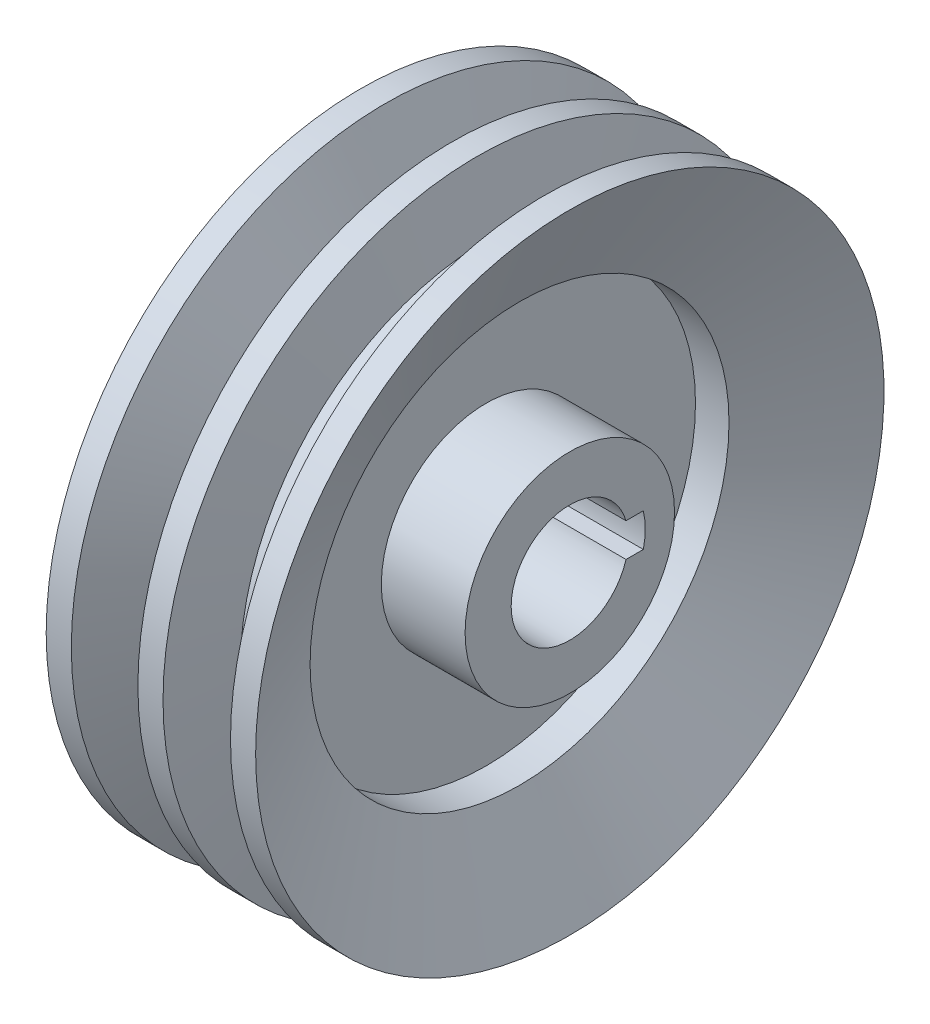
ISO-10303-21;
HEADER;
FILE_DESCRIPTION(('STEP AP214'),'2;1');
FILE_NAME('part.step','',(''),(''),'','','');
FILE_SCHEMA(('AUTOMOTIVE_DESIGN { 1 0 10303 214 1 1 1 1 }'));
ENDSEC;
DATA;
#1=APPLICATION_CONTEXT('core data for automotive mechanical design processes');
#2=APPLICATION_PROTOCOL_DEFINITION('international standard','automotive_design',2000,#1);
#3=PRODUCT_CONTEXT('',#1,'mechanical');
#4=PRODUCT('Part','Part','',(#3));
#5=PRODUCT_RELATED_PRODUCT_CATEGORY('part','',(#4));
#6=PRODUCT_DEFINITION_FORMATION('','',#4);
#7=PRODUCT_DEFINITION_CONTEXT('part definition',#1,'design');
#8=PRODUCT_DEFINITION('design','',#6,#7);
#9=PRODUCT_DEFINITION_SHAPE('','',#8);
#10=(LENGTH_UNIT() NAMED_UNIT(*) SI_UNIT(.MILLI.,.METRE.));
#11=(NAMED_UNIT(*) PLANE_ANGLE_UNIT() SI_UNIT($,.RADIAN.));
#12=(NAMED_UNIT(*) SI_UNIT($,.STERADIAN.) SOLID_ANGLE_UNIT());
#13=UNCERTAINTY_MEASURE_WITH_UNIT(LENGTH_MEASURE(1.E-05),#10,'distance_accuracy_value','');
#14=(GEOMETRIC_REPRESENTATION_CONTEXT(3) GLOBAL_UNCERTAINTY_ASSIGNED_CONTEXT((#13)) GLOBAL_UNIT_ASSIGNED_CONTEXT((#10,
#11,#12)) REPRESENTATION_CONTEXT('',''));
#15=CARTESIAN_POINT('',(0.,0.,0.));
#16=DIRECTION('',(0.,0.,1.));
#17=DIRECTION('',(1.,0.,0.));
#18=AXIS2_PLACEMENT_3D('',#15,#16,#17);
#19=CARTESIAN_POINT('',(-757.808630679209,-495.3,0.));
#20=DIRECTION('',(-1.,0.,0.));
#21=DIRECTION('',(0.,0.,1.));
#22=AXIS2_PLACEMENT_3D('',#19,#20,#21);
#23=CYLINDRICAL_SURFACE('',#22,635.);
#24=CARTESIAN_POINT('',(127.,-495.3,0.));
#25=DIRECTION('',(-1.,0.,0.));
#26=DIRECTION('',(0.,0.,1.));
#27=AXIS2_PLACEMENT_3D('',#24,#25,#26);
#28=CIRCLE('',#27,635.);
#29=CARTESIAN_POINT('',(127.,-495.3,635.));
#30=VERTEX_POINT('',#29);
#31=EDGE_CURVE('E11',#30,#30,#28,.T.);
#32=ORIENTED_EDGE('',*,*,#31,.F.);
#33=EDGE_LOOP('',(#32));
#34=FACE_BOUND('',#33,.T.);
#35=CARTESIAN_POINT('',(635.,-495.3,0.));
#36=DIRECTION('',(-1.,0.,0.));
#37=DIRECTION('',(0.,0.,1.));
#38=AXIS2_PLACEMENT_3D('',#35,#36,#37);
#39=CIRCLE('',#38,635.);
#40=CARTESIAN_POINT('',(635.,-495.3,635.));
#41=VERTEX_POINT('',#40);
#42=EDGE_CURVE('E92',#41,#41,#39,.T.);
#43=ORIENTED_EDGE('',*,*,#42,.T.);
#44=EDGE_LOOP('',(#43));
#45=FACE_BOUND('',#44,.T.);
#46=ADVANCED_FACE('F37',(#34,#45),#23,.T.);
#47=CARTESIAN_POINT('',(127.,774.7,0.));
#48=DIRECTION('',(-1.,0.,0.));
#49=DIRECTION('',(0.,0.,1.));
#50=AXIS2_PLACEMENT_3D('',#47,#48,#49);
#51=PLANE('',#50);
#52=CARTESIAN_POINT('',(127.,-495.3,0.));
#53=DIRECTION('',(-1.,0.,0.));
#54=DIRECTION('',(0.,0.,1.));
#55=AXIS2_PLACEMENT_3D('',#52,#53,#54);
#56=CIRCLE('',#55,1270.);
#57=CARTESIAN_POINT('',(127.,-495.3,1270.));
#58=VERTEX_POINT('',#57);
#59=EDGE_CURVE('E44',#58,#58,#56,.T.);
#60=ORIENTED_EDGE('',*,*,#59,.F.);
#61=EDGE_LOOP('',(#60));
#62=FACE_BOUND('',#61,.T.);
#63=ORIENTED_EDGE('',*,*,#31,.T.);
#64=EDGE_LOOP('',(#63));
#65=FACE_BOUND('',#64,.T.);
#66=ADVANCED_FACE('F164',(#62,#65),#51,.F.);
#67=CARTESIAN_POINT('',(-757.808630679209,-495.3,0.));
#68=DIRECTION('',(-1.,0.,0.));
#69=DIRECTION('',(0.,0.,1.));
#70=AXIS2_PLACEMENT_3D('',#67,#68,#69);
#71=CYLINDRICAL_SURFACE('',#70,1270.);
#72=CARTESIAN_POINT('',(330.2,-495.3,0.));
#73=DIRECTION('',(-1.,0.,0.));
#74=DIRECTION('',(0.,0.,1.));
#75=AXIS2_PLACEMENT_3D('',#72,#73,#74);
#76=CIRCLE('',#75,1270.);
#77=CARTESIAN_POINT('',(330.2,-495.3,1270.));
#78=VERTEX_POINT('',#77);
#79=EDGE_CURVE('E157',#78,#78,#76,.T.);
#80=ORIENTED_EDGE('',*,*,#79,.F.);
#81=EDGE_LOOP('',(#80));
#82=FACE_BOUND('',#81,.T.);
#83=ORIENTED_EDGE('',*,*,#59,.T.);
#84=EDGE_LOOP('',(#83));
#85=FACE_BOUND('',#84,.T.);
#86=ADVANCED_FACE('F162',(#82,#85),#71,.F.);
#87=CARTESIAN_POINT('',(330.2,-495.3,0.));
#88=DIRECTION('',(1.,0.,0.));
#89=DIRECTION('',(0.,0.,-1.));
#90=AXIS2_PLACEMENT_3D('',#87,#88,#89);
#91=CONICAL_SURFACE('',#90,1270.,1.12327635163773);
#92=CARTESIAN_POINT('',(635.,-495.3,0.));
#93=DIRECTION('',(-1.,0.,0.));
#94=DIRECTION('',(0.,0.,1.));
#95=AXIS2_PLACEMENT_3D('',#92,#93,#94);
#96=CIRCLE('',#95,1905.);
#97=CARTESIAN_POINT('',(635.,-495.3,1905.));
#98=VERTEX_POINT('',#97);
#99=EDGE_CURVE('E154',#98,#98,#96,.T.);
#100=ORIENTED_EDGE('',*,*,#99,.F.);
#101=EDGE_LOOP('',(#100));
#102=FACE_BOUND('',#101,.T.);
#103=ORIENTED_EDGE('',*,*,#79,.T.);
#104=EDGE_LOOP('',(#103));
#105=FACE_BOUND('',#104,.T.);
#106=ADVANCED_FACE('F247',(#102,#105),#91,.F.);
#107=CARTESIAN_POINT('',(-757.808630679209,-495.3,0.));
#108=DIRECTION('',(-1.,0.,0.));
#109=DIRECTION('',(0.,0.,1.));
#110=AXIS2_PLACEMENT_3D('',#107,#108,#109);
#111=CYLINDRICAL_SURFACE('',#110,1905.);
#112=CARTESIAN_POINT('',(482.6,-495.3,0.));
#113=DIRECTION('',(-1.,0.,0.));
#114=DIRECTION('',(0.,0.,1.));
#115=AXIS2_PLACEMENT_3D('',#112,#113,#114);
#116=CIRCLE('',#115,1905.);
#117=CARTESIAN_POINT('',(482.6,-495.3,1905.));
#118=VERTEX_POINT('',#117);
#119=EDGE_CURVE('E151',#118,#118,#116,.T.);
#120=ORIENTED_EDGE('',*,*,#119,.F.);
#121=EDGE_LOOP('',(#120));
#122=FACE_BOUND('',#121,.T.);
#123=ORIENTED_EDGE('',*,*,#99,.T.);
#124=EDGE_LOOP('',(#123));
#125=FACE_BOUND('',#124,.T.);
#126=ADVANCED_FACE('F243',(#122,#125),#111,.T.);
#127=CARTESIAN_POINT('',(482.6,-495.3,0.));
#128=DIRECTION('',(1.,0.,0.));
#129=DIRECTION('',(0.,0.,-1.));
#130=AXIS2_PLACEMENT_3D('',#127,#128,#129);
#131=CONICAL_SURFACE('',#130,1905.,1.12327635163773);
#132=CARTESIAN_POINT('',(287.528,-495.3,0.));
#133=DIRECTION('',(-1.,0.,0.));
#134=DIRECTION('',(0.,0.,1.));
#135=AXIS2_PLACEMENT_3D('',#132,#133,#134);
#136=CIRCLE('',#135,1498.6);
#137=CARTESIAN_POINT('',(287.528,-495.3,1498.6));
#138=VERTEX_POINT('',#137);
#139=EDGE_CURVE('E148',#138,#138,#136,.T.);
#140=ORIENTED_EDGE('',*,*,#139,.F.);
#141=EDGE_LOOP('',(#140));
#142=FACE_BOUND('',#141,.T.);
#143=ORIENTED_EDGE('',*,*,#119,.T.);
#144=EDGE_LOOP('',(#143));
#145=FACE_BOUND('',#144,.T.);
#146=ADVANCED_FACE('F239',(#142,#145),#131,.T.);
#147=CARTESIAN_POINT('',(-757.808630679209,-495.3,0.));
#148=DIRECTION('',(-1.,0.,0.));
#149=DIRECTION('',(0.,0.,1.));
#150=AXIS2_PLACEMENT_3D('',#147,#148,#149);
#151=CYLINDRICAL_SURFACE('',#150,1498.6);
#152=CARTESIAN_POINT('',(135.128,-495.3,0.));
#153=DIRECTION('',(-1.,0.,0.));
#154=DIRECTION('',(0.,0.,1.));
#155=AXIS2_PLACEMENT_3D('',#152,#153,#154);
#156=CIRCLE('',#155,1498.6);
#157=CARTESIAN_POINT('',(135.128,-495.3,1498.6));
#158=VERTEX_POINT('',#157);
#159=EDGE_CURVE('E145',#158,#158,#156,.T.);
#160=ORIENTED_EDGE('',*,*,#159,.F.);
#161=EDGE_LOOP('',(#160));
#162=FACE_BOUND('',#161,.T.);
#163=ORIENTED_EDGE('',*,*,#139,.T.);
#164=EDGE_LOOP('',(#163));
#165=FACE_BOUND('',#164,.T.);
#166=ADVANCED_FACE('F235',(#162,#165),#151,.T.);
#167=CARTESIAN_POINT('',(135.128,-495.3,0.));
#168=DIRECTION('',(-1.,0.,0.));
#169=DIRECTION('',(0.,0.,1.));
#170=AXIS2_PLACEMENT_3D('',#167,#168,#169);
#171=CONICAL_SURFACE('',#170,1498.6,1.42035083214526);
#172=CARTESIAN_POINT('',(73.521450378508,-495.3,0.));
#173=DIRECTION('',(-1.,0.,0.));
#174=DIRECTION('',(0.,0.,1.));
#175=AXIS2_PLACEMENT_3D('',#172,#173,#174);
#176=CIRCLE('',#175,1905.);
#177=CARTESIAN_POINT('',(73.521450378508,-495.3,1905.));
#178=VERTEX_POINT('',#177);
#179=EDGE_CURVE('E142',#178,#178,#176,.T.);
#180=ORIENTED_EDGE('',*,*,#179,.F.);
#181=EDGE_LOOP('',(#180));
#182=FACE_BOUND('',#181,.T.);
#183=ORIENTED_EDGE('',*,*,#159,.T.);
#184=EDGE_LOOP('',(#183));
#185=FACE_BOUND('',#184,.T.);
#186=ADVANCED_FACE('F231',(#182,#185),#171,.T.);
#187=CARTESIAN_POINT('',(-757.808630679209,-495.3,0.));
#188=DIRECTION('',(-1.,0.,0.));
#189=DIRECTION('',(0.,0.,1.));
#190=AXIS2_PLACEMENT_3D('',#187,#188,#189);
#191=CYLINDRICAL_SURFACE('',#190,1905.);
#192=CARTESIAN_POINT('',(-78.878549621492,-495.3,0.));
#193=DIRECTION('',(-1.,0.,0.));
#194=DIRECTION('',(0.,0.,1.));
#195=AXIS2_PLACEMENT_3D('',#192,#193,#194);
#196=CIRCLE('',#195,1905.);
#197=CARTESIAN_POINT('',(-78.878549621492,-495.3,1905.));
#198=VERTEX_POINT('',#197);
#199=EDGE_CURVE('E139',#198,#198,#196,.T.);
#200=ORIENTED_EDGE('',*,*,#199,.F.);
#201=EDGE_LOOP('',(#200));
#202=FACE_BOUND('',#201,.T.);
#203=ORIENTED_EDGE('',*,*,#179,.T.);
#204=EDGE_LOOP('',(#203));
#205=FACE_BOUND('',#204,.T.);
#206=ADVANCED_FACE('F227',(#202,#205),#191,.T.);
#207=CARTESIAN_POINT('',(-78.878549621492,-495.3,0.));
#208=DIRECTION('',(1.,0.,0.));
#209=DIRECTION('',(0.,0.,-1.));
#210=AXIS2_PLACEMENT_3D('',#207,#208,#209);
#211=CONICAL_SURFACE('',#210,1905.,1.43326106171532);
#212=CARTESIAN_POINT('',(-135.128,-495.3,0.));
#213=DIRECTION('',(-1.,0.,0.));
#214=DIRECTION('',(0.,0.,1.));
#215=AXIS2_PLACEMENT_3D('',#212,#213,#214);
#216=CIRCLE('',#215,1498.6);
#217=CARTESIAN_POINT('',(-135.128,-495.3,1498.6));
#218=VERTEX_POINT('',#217);
#219=EDGE_CURVE('E136',#218,#218,#216,.T.);
#220=ORIENTED_EDGE('',*,*,#219,.F.);
#221=EDGE_LOOP('',(#220));
#222=FACE_BOUND('',#221,.T.);
#223=ORIENTED_EDGE('',*,*,#199,.T.);
#224=EDGE_LOOP('',(#223));
#225=FACE_BOUND('',#224,.T.);
#226=ADVANCED_FACE('F223',(#222,#225),#211,.T.);
#227=CARTESIAN_POINT('',(-757.808630679209,-495.3,0.));
#228=DIRECTION('',(-1.,0.,0.));
#229=DIRECTION('',(0.,0.,1.));
#230=AXIS2_PLACEMENT_3D('',#227,#228,#229);
#231=CYLINDRICAL_SURFACE('',#230,1498.6);
#232=CARTESIAN_POINT('',(-287.528,-495.3,0.));
#233=DIRECTION('',(-1.,0.,0.));
#234=DIRECTION('',(0.,0.,1.));
#235=AXIS2_PLACEMENT_3D('',#232,#233,#234);
#236=CIRCLE('',#235,1498.6);
#237=CARTESIAN_POINT('',(-287.528,-495.3,1498.6));
#238=VERTEX_POINT('',#237);
#239=EDGE_CURVE('E133',#238,#238,#236,.T.);
#240=ORIENTED_EDGE('',*,*,#239,.F.);
#241=EDGE_LOOP('',(#240));
#242=FACE_BOUND('',#241,.T.);
#243=ORIENTED_EDGE('',*,*,#219,.T.);
#244=EDGE_LOOP('',(#243));
#245=FACE_BOUND('',#244,.T.);
#246=ADVANCED_FACE('F219',(#242,#245),#231,.T.);
#247=CARTESIAN_POINT('',(-287.528,-495.3,0.));
#248=DIRECTION('',(-1.,0.,0.));
#249=DIRECTION('',(0.,0.,1.));
#250=AXIS2_PLACEMENT_3D('',#247,#248,#249);
#251=CONICAL_SURFACE('',#250,1498.6,1.12327635163773);
#252=CARTESIAN_POINT('',(-482.6,-495.3,0.));
#253=DIRECTION('',(-1.,0.,0.));
#254=DIRECTION('',(0.,0.,1.));
#255=AXIS2_PLACEMENT_3D('',#252,#253,#254);
#256=CIRCLE('',#255,1905.);
#257=CARTESIAN_POINT('',(-482.6,-495.3,1905.));
#258=VERTEX_POINT('',#257);
#259=EDGE_CURVE('E130',#258,#258,#256,.T.);
#260=ORIENTED_EDGE('',*,*,#259,.F.);
#261=EDGE_LOOP('',(#260));
#262=FACE_BOUND('',#261,.T.);
#263=ORIENTED_EDGE('',*,*,#239,.T.);
#264=EDGE_LOOP('',(#263));
#265=FACE_BOUND('',#264,.T.);
#266=ADVANCED_FACE('F215',(#262,#265),#251,.T.);
#267=CARTESIAN_POINT('',(-757.808630679209,-495.3,0.));
#268=DIRECTION('',(-1.,0.,0.));
#269=DIRECTION('',(0.,0.,1.));
#270=AXIS2_PLACEMENT_3D('',#267,#268,#269);
#271=CYLINDRICAL_SURFACE('',#270,1905.);
#272=CARTESIAN_POINT('',(-635.,-495.3,0.));
#273=DIRECTION('',(-1.,0.,0.));
#274=DIRECTION('',(0.,0.,1.));
#275=AXIS2_PLACEMENT_3D('',#272,#273,#274);
#276=CIRCLE('',#275,1905.);
#277=CARTESIAN_POINT('',(-635.,-495.3,1905.));
#278=VERTEX_POINT('',#277);
#279=EDGE_CURVE('E127',#278,#278,#276,.T.);
#280=ORIENTED_EDGE('',*,*,#279,.F.);
#281=EDGE_LOOP('',(#280));
#282=FACE_BOUND('',#281,.T.);
#283=ORIENTED_EDGE('',*,*,#259,.T.);
#284=EDGE_LOOP('',(#283));
#285=FACE_BOUND('',#284,.T.);
#286=ADVANCED_FACE('F211',(#282,#285),#271,.T.);
#287=CARTESIAN_POINT('',(-635.,-495.3,0.));
#288=DIRECTION('',(-1.,0.,0.));
#289=DIRECTION('',(0.,0.,1.));
#290=AXIS2_PLACEMENT_3D('',#287,#288,#289);
#291=CONICAL_SURFACE('',#290,1905.,1.12327635163773);
#292=CARTESIAN_POINT('',(-330.2,-495.3,0.));
#293=DIRECTION('',(-1.,0.,0.));
#294=DIRECTION('',(0.,0.,1.));
#295=AXIS2_PLACEMENT_3D('',#292,#293,#294);
#296=CIRCLE('',#295,1270.);
#297=CARTESIAN_POINT('',(-330.2,-495.3,1270.));
#298=VERTEX_POINT('',#297);
#299=EDGE_CURVE('E124',#298,#298,#296,.T.);
#300=ORIENTED_EDGE('',*,*,#299,.F.);
#301=EDGE_LOOP('',(#300));
#302=FACE_BOUND('',#301,.T.);
#303=ORIENTED_EDGE('',*,*,#279,.T.);
#304=EDGE_LOOP('',(#303));
#305=FACE_BOUND('',#304,.T.);
#306=ADVANCED_FACE('F207',(#302,#305),#291,.F.);
#307=CARTESIAN_POINT('',(-757.808630679209,-495.3,0.));
#308=DIRECTION('',(-1.,0.,0.));
#309=DIRECTION('',(0.,0.,1.));
#310=AXIS2_PLACEMENT_3D('',#307,#308,#309);
#311=CYLINDRICAL_SURFACE('',#310,1270.);
#312=CARTESIAN_POINT('',(-127.,-495.3,0.));
#313=DIRECTION('',(-1.,0.,0.));
#314=DIRECTION('',(0.,0.,1.));
#315=AXIS2_PLACEMENT_3D('',#312,#313,#314);
#316=CIRCLE('',#315,1270.);
#317=CARTESIAN_POINT('',(-127.,-495.3,1270.));
#318=VERTEX_POINT('',#317);
#319=EDGE_CURVE('E121',#318,#318,#316,.T.);
#320=ORIENTED_EDGE('',*,*,#319,.F.);
#321=EDGE_LOOP('',(#320));
#322=FACE_BOUND('',#321,.T.);
#323=ORIENTED_EDGE('',*,*,#299,.T.);
#324=EDGE_LOOP('',(#323));
#325=FACE_BOUND('',#324,.T.);
#326=ADVANCED_FACE('F203',(#322,#325),#311,.F.);
#327=CARTESIAN_POINT('',(-127.,139.7,0.));
#328=DIRECTION('',(1.,0.,0.));
#329=DIRECTION('',(0.,0.,-1.));
#330=AXIS2_PLACEMENT_3D('',#327,#328,#329);
#331=PLANE('',#330);
#332=CARTESIAN_POINT('',(-127.,-495.3,0.));
#333=DIRECTION('',(-1.,0.,0.));
#334=DIRECTION('',(0.,0.,1.));
#335=AXIS2_PLACEMENT_3D('',#332,#333,#334);
#336=CIRCLE('',#335,635.);
#337=CARTESIAN_POINT('',(-127.,-495.3,635.));
#338=VERTEX_POINT('',#337);
#339=EDGE_CURVE('E118',#338,#338,#336,.T.);
#340=ORIENTED_EDGE('',*,*,#339,.F.);
#341=EDGE_LOOP('',(#340));
#342=FACE_BOUND('',#341,.T.);
#343=ORIENTED_EDGE('',*,*,#319,.T.);
#344=EDGE_LOOP('',(#343));
#345=FACE_BOUND('',#344,.T.);
#346=ADVANCED_FACE('F199',(#342,#345),#331,.F.);
#347=CARTESIAN_POINT('',(-757.808630679209,-495.3,0.));
#348=DIRECTION('',(-1.,0.,0.));
#349=DIRECTION('',(0.,0.,1.));
#350=AXIS2_PLACEMENT_3D('',#347,#348,#349);
#351=CYLINDRICAL_SURFACE('',#350,635.);
#352=CARTESIAN_POINT('',(-635.,-495.3,0.));
#353=DIRECTION('',(-1.,0.,0.));
#354=DIRECTION('',(0.,0.,1.));
#355=AXIS2_PLACEMENT_3D('',#352,#353,#354);
#356=CIRCLE('',#355,635.);
#357=CARTESIAN_POINT('',(-635.,-495.3,635.));
#358=VERTEX_POINT('',#357);
#359=EDGE_CURVE('E115',#358,#358,#356,.T.);
#360=ORIENTED_EDGE('',*,*,#359,.F.);
#361=EDGE_LOOP('',(#360));
#362=FACE_BOUND('',#361,.T.);
#363=ORIENTED_EDGE('',*,*,#339,.T.);
#364=EDGE_LOOP('',(#363));
#365=FACE_BOUND('',#364,.T.);
#366=ADVANCED_FACE('F196',(#362,#365),#351,.T.);
#367=CARTESIAN_POINT('',(-635.,-139.7,0.));
#368=DIRECTION('',(1.,0.,0.));
#369=DIRECTION('',(0.,0.,-1.));
#370=AXIS2_PLACEMENT_3D('',#367,#368,#369);
#371=PLANE('',#370);
#372=CARTESIAN_POINT('',(-635.,-495.3,0.));
#373=DIRECTION('',(-1.,0.,0.));
#374=DIRECTION('',(0.,0.,1.));
#375=AXIS2_PLACEMENT_3D('',#372,#373,#374);
#376=CIRCLE('',#375,355.6);
#377=CARTESIAN_POINT('',(-635.,-596.9,-340.776759770968));
#378=VERTEX_POINT('',#377);
#379=CARTESIAN_POINT('',(-635.,-393.7,-340.776759770968));
#380=VERTEX_POINT('',#379);
#381=EDGE_CURVE('E113',#378,#380,#376,.T.);
#382=ORIENTED_EDGE('',*,*,#381,.F.);
#383=DIRECTION('',(0.,0.,1.));
#384=VECTOR('',#383,1.);
#385=CARTESIAN_POINT('',(-635.,-596.9,-340.776759770968));
#386=LINE('',#385,#384);
#387=CARTESIAN_POINT('',(-635.,-596.9,-445.76819087952));
#388=VERTEX_POINT('',#387);
#389=EDGE_CURVE('E96',#388,#378,#386,.T.);
#390=ORIENTED_EDGE('',*,*,#389,.F.);
#391=CARTESIAN_POINT('',(-635.,-495.3,1.11022302462516E-13));
#392=DIRECTION('',(1.,0.,0.));
#393=DIRECTION('',(0.,0.,-1.));
#394=AXIS2_PLACEMENT_3D('',#391,#392,#393);
#395=CIRCLE('',#394,457.2);
#396=CARTESIAN_POINT('',(-635.,-393.7,-445.76819087952));
#397=VERTEX_POINT('',#396);
#398=EDGE_CURVE('E78',#397,#388,#395,.F.);
#399=ORIENTED_EDGE('',*,*,#398,.F.);
#400=DIRECTION('',(0.,0.,-1.));
#401=VECTOR('',#400,1.);
#402=CARTESIAN_POINT('',(-635.,-393.7,-340.776759770968));
#403=LINE('',#402,#401);
#404=EDGE_CURVE('E86',#380,#397,#403,.T.);
#405=ORIENTED_EDGE('',*,*,#404,.F.);
#406=EDGE_LOOP('',(#382,#390,#399,#405));
#407=FACE_BOUND('',#406,.T.);
#408=ORIENTED_EDGE('',*,*,#359,.T.);
#409=EDGE_LOOP('',(#408));
#410=FACE_BOUND('',#409,.T.);
#411=ADVANCED_FACE('F94',(#407,#410),#371,.F.);
#412=CARTESIAN_POINT('',(-757.808630679209,-495.3,0.));
#413=DIRECTION('',(-1.,0.,0.));
#414=DIRECTION('',(0.,0.,1.));
#415=AXIS2_PLACEMENT_3D('',#412,#413,#414);
#416=CYLINDRICAL_SURFACE('',#415,355.6);
#417=CARTESIAN_POINT('',(635.,-495.3,0.));
#418=DIRECTION('',(-1.,0.,0.));
#419=DIRECTION('',(0.,0.,1.));
#420=AXIS2_PLACEMENT_3D('',#417,#418,#419);
#421=CIRCLE('',#420,355.6);
#422=CARTESIAN_POINT('',(635.,-596.9,-340.776759770968));
#423=VERTEX_POINT('',#422);
#424=CARTESIAN_POINT('',(635.,-393.7,-340.776759770968));
#425=VERTEX_POINT('',#424);
#426=EDGE_CURVE('E110',#423,#425,#421,.T.);
#427=ORIENTED_EDGE('',*,*,#426,.F.);
#428=DIRECTION('',(1.,0.,0.));
#429=VECTOR('',#428,1.);
#430=CARTESIAN_POINT('',(-635.001,-596.9,-340.776759770968));
#431=LINE('',#430,#429);
#432=EDGE_CURVE('E105',#378,#423,#431,.T.);
#433=ORIENTED_EDGE('',*,*,#432,.F.);
#434=ORIENTED_EDGE('',*,*,#381,.T.);
#435=DIRECTION('',(1.,0.,0.));
#436=VECTOR('',#435,1.);
#437=CARTESIAN_POINT('',(-635.001,-393.7,-340.776759770968));
#438=LINE('',#437,#436);
#439=EDGE_CURVE('E82',#380,#425,#438,.T.);
#440=ORIENTED_EDGE('',*,*,#439,.T.);
#441=EDGE_LOOP('',(#427,#433,#434,#440));
#442=FACE_BOUND('',#441,.T.);
#443=ADVANCED_FACE('F176',(#442),#416,.F.);
#444=CARTESIAN_POINT('',(635.,-139.7,0.));
#445=DIRECTION('',(-1.,0.,0.));
#446=DIRECTION('',(0.,0.,1.));
#447=AXIS2_PLACEMENT_3D('',#444,#445,#446);
#448=PLANE('',#447);
#449=ORIENTED_EDGE('',*,*,#42,.F.);
#450=EDGE_LOOP('',(#449));
#451=FACE_BOUND('',#450,.T.);
#452=CARTESIAN_POINT('',(635.,-495.3,1.11022302462516E-13));
#453=DIRECTION('',(1.,0.,0.));
#454=DIRECTION('',(0.,0.,1.));
#455=AXIS2_PLACEMENT_3D('',#452,#453,#454);
#456=CIRCLE('',#455,457.2);
#457=CARTESIAN_POINT('',(635.,-596.9,-445.76819087952));
#458=VERTEX_POINT('',#457);
#459=CARTESIAN_POINT('',(635.,-393.7,-445.76819087952));
#460=VERTEX_POINT('',#459);
#461=EDGE_CURVE('E51',#458,#460,#456,.T.);
#462=ORIENTED_EDGE('',*,*,#461,.F.);
#463=DIRECTION('',(0.,0.,-1.));
#464=VECTOR('',#463,1.);
#465=CARTESIAN_POINT('',(635.,-596.9,-340.776759770968));
#466=LINE('',#465,#464);
#467=EDGE_CURVE('E83',#423,#458,#466,.T.);
#468=ORIENTED_EDGE('',*,*,#467,.F.);
#469=ORIENTED_EDGE('',*,*,#426,.T.);
#470=DIRECTION('',(0.,0.,1.));
#471=VECTOR('',#470,1.);
#472=CARTESIAN_POINT('',(635.,-393.7,-340.776759770968));
#473=LINE('',#472,#471);
#474=EDGE_CURVE('E101',#460,#425,#473,.T.);
#475=ORIENTED_EDGE('',*,*,#474,.F.);
#476=EDGE_LOOP('',(#462,#468,#469,#475));
#477=FACE_BOUND('',#476,.T.);
#478=ADVANCED_FACE('F173',(#451,#477),#448,.F.);
#479=CARTESIAN_POINT('',(-635.001,-495.3,1.11022302462516E-13));
#480=DIRECTION('',(1.,0.,0.));
#481=DIRECTION('',(0.,0.,-1.));
#482=AXIS2_PLACEMENT_3D('',#479,#480,#481);
#483=CYLINDRICAL_SURFACE('',#482,457.2);
#484=ORIENTED_EDGE('',*,*,#398,.T.);
#485=DIRECTION('',(1.,0.,0.));
#486=VECTOR('',#485,1.);
#487=CARTESIAN_POINT('',(-635.001,-596.9,-445.76819087952));
#488=LINE('',#487,#486);
#489=EDGE_CURVE('E58',#388,#458,#488,.T.);
#490=ORIENTED_EDGE('',*,*,#489,.T.);
#491=ORIENTED_EDGE('',*,*,#461,.T.);
#492=DIRECTION('',(1.,0.,0.));
#493=VECTOR('',#492,1.);
#494=CARTESIAN_POINT('',(-635.001,-393.7,-445.76819087952));
#495=LINE('',#494,#493);
#496=EDGE_CURVE('E74',#397,#460,#495,.T.);
#497=ORIENTED_EDGE('',*,*,#496,.F.);
#498=EDGE_LOOP('',(#484,#490,#491,#497));
#499=FACE_BOUND('',#498,.T.);
#500=ADVANCED_FACE('F76',(#499),#483,.F.);
#501=CARTESIAN_POINT('',(-635.001,-596.9,-340.776759770968));
#502=DIRECTION('',(0.,-1.,0.));
#503=DIRECTION('',(0.,0.,-1.));
#504=AXIS2_PLACEMENT_3D('',#501,#502,#503);
#505=PLANE('',#504);
#506=ORIENTED_EDGE('',*,*,#389,.T.);
#507=ORIENTED_EDGE('',*,*,#432,.T.);
#508=ORIENTED_EDGE('',*,*,#467,.T.);
#509=ORIENTED_EDGE('',*,*,#489,.F.);
#510=EDGE_LOOP('',(#506,#507,#508,#509));
#511=FACE_BOUND('',#510,.T.);
#512=ADVANCED_FACE('F182',(#511),#505,.F.);
#513=CARTESIAN_POINT('',(-635.001,-393.7,-340.776759770968));
#514=DIRECTION('',(0.,1.,0.));
#515=DIRECTION('',(0.,0.,1.));
#516=AXIS2_PLACEMENT_3D('',#513,#514,#515);
#517=PLANE('',#516);
#518=ORIENTED_EDGE('',*,*,#404,.T.);
#519=ORIENTED_EDGE('',*,*,#496,.T.);
#520=ORIENTED_EDGE('',*,*,#474,.T.);
#521=ORIENTED_EDGE('',*,*,#439,.F.);
#522=EDGE_LOOP('',(#518,#519,#520,#521));
#523=FACE_BOUND('',#522,.T.);
#524=ADVANCED_FACE('F87',(#523),#517,.F.);
#525=CLOSED_SHELL('',(#46,#66,#86,#106,#126,#146,#166,#186,#206,#226,#246,#266,#286,#306,#326,
#346,#366,#411,#443,#478,#500,#512,#524));
#526=MANIFOLD_SOLID_BREP('B2',#525);
#527=ADVANCED_BREP_SHAPE_REPRESENTATION('',(#18,#526),#14);
#528=SHAPE_DEFINITION_REPRESENTATION(#9,#527);
ENDSEC;
END-ISO-10303-21;
